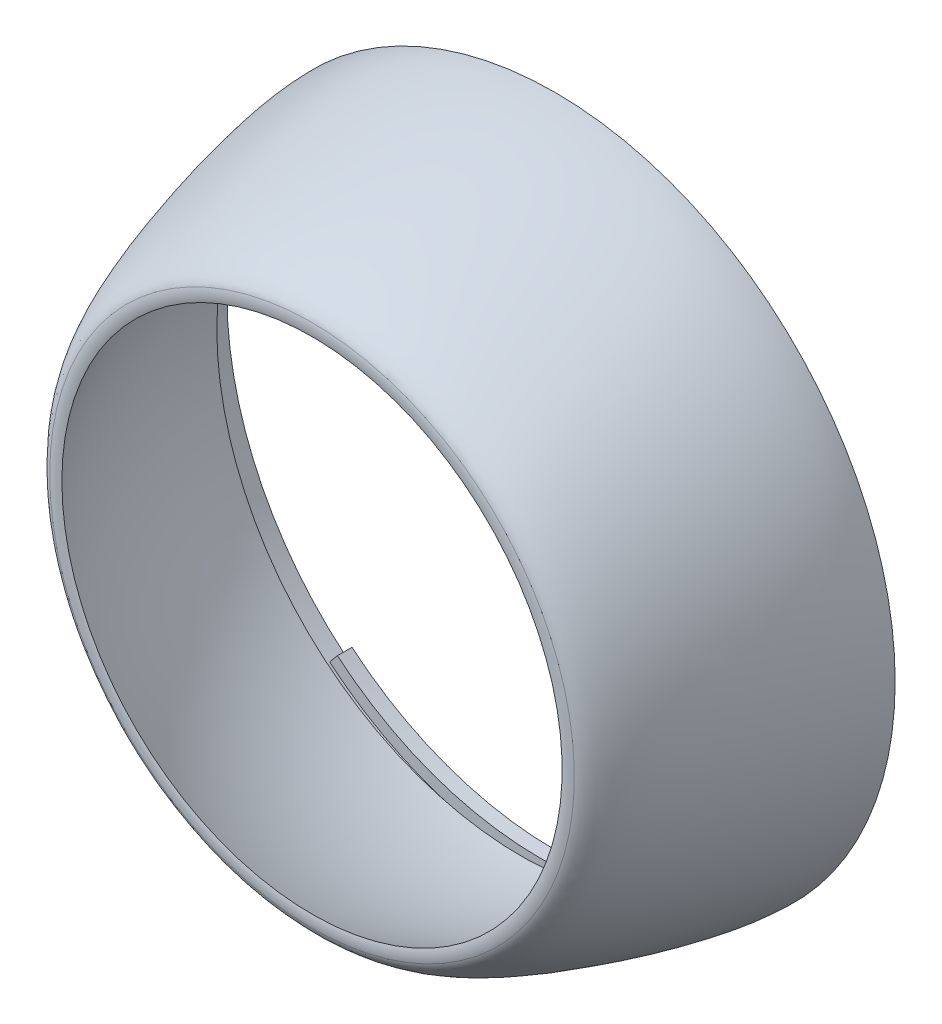
ISO-10303-21;
HEADER;
FILE_DESCRIPTION(('STEP AP214'),'2;1');
FILE_NAME('part.step','',(''),(''),'','','');
FILE_SCHEMA(('AUTOMOTIVE_DESIGN { 1 0 10303 214 1 1 1 1 }'));
ENDSEC;
DATA;
#1=APPLICATION_CONTEXT('core data for automotive mechanical design processes');
#2=APPLICATION_PROTOCOL_DEFINITION('international standard','automotive_design',2000,#1);
#3=PRODUCT_CONTEXT('',#1,'mechanical');
#4=PRODUCT('Part','Part','',(#3));
#5=PRODUCT_RELATED_PRODUCT_CATEGORY('part','',(#4));
#6=PRODUCT_DEFINITION_FORMATION('','',#4);
#7=PRODUCT_DEFINITION_CONTEXT('part definition',#1,'design');
#8=PRODUCT_DEFINITION('design','',#6,#7);
#9=PRODUCT_DEFINITION_SHAPE('','',#8);
#10=(LENGTH_UNIT() NAMED_UNIT(*) SI_UNIT(.MILLI.,.METRE.));
#11=(NAMED_UNIT(*) PLANE_ANGLE_UNIT() SI_UNIT($,.RADIAN.));
#12=(NAMED_UNIT(*) SI_UNIT($,.STERADIAN.) SOLID_ANGLE_UNIT());
#13=UNCERTAINTY_MEASURE_WITH_UNIT(LENGTH_MEASURE(1.E-05),#10,'distance_accuracy_value','');
#14=(GEOMETRIC_REPRESENTATION_CONTEXT(3) GLOBAL_UNCERTAINTY_ASSIGNED_CONTEXT((#13)) GLOBAL_UNIT_ASSIGNED_CONTEXT((#10,
#11,#12)) REPRESENTATION_CONTEXT('',''));
#15=CARTESIAN_POINT('',(0.,0.,0.));
#16=DIRECTION('',(0.,0.,1.));
#17=DIRECTION('',(1.,0.,0.));
#18=AXIS2_PLACEMENT_3D('',#15,#16,#17);
#19=CARTESIAN_POINT('',(0.,20.5897107952854,20.));
#20=CARTESIAN_POINT('',(0.,25.4987449525054,10.5850621443929));
#21=CARTESIAN_POINT('',(0.,25.,0.));
#22=B_SPLINE_CURVE_WITH_KNOTS('',2,(#19,#20,#21),.UNSPECIFIED.,.F.,.F.,(3,3),(0.,1.),.UNSPECIFIED.);
#23=CARTESIAN_POINT('',(0.,0.,0.));
#24=DIRECTION('',(0.,0.,-1.));
#25=AXIS1_PLACEMENT('',#23,#24);
#26=SURFACE_OF_REVOLUTION('',#22,#25);
#27=CARTESIAN_POINT('',(0.,0.,20.));
#28=DIRECTION('',(0.,0.,-1.));
#29=DIRECTION('',(-1.,0.,0.));
#30=AXIS2_PLACEMENT_3D('',#27,#28,#29);
#31=CIRCLE('',#30,20.5897107952854);
#32=CARTESIAN_POINT('',(-20.5897107952854,0.,20.));
#33=VERTEX_POINT('',#32);
#34=EDGE_CURVE('E199',#33,#33,#31,.T.);
#35=ORIENTED_EDGE('',*,*,#34,.F.);
#36=EDGE_LOOP('',(#35));
#37=FACE_BOUND('',#36,.T.);
#38=CARTESIAN_POINT('',(0.,0.,2.8));
#39=DIRECTION('',(0.,0.,-1.));
#40=DIRECTION('',(-1.,0.,0.));
#41=AXIS2_PLACEMENT_3D('',#38,#39,#40);
#42=CIRCLE('',#41,25.0369004081531);
#43=CARTESIAN_POINT('',(-25.0369004081531,0.,2.8));
#44=VERTEX_POINT('',#43);
#45=EDGE_CURVE('E78',#44,#44,#42,.T.);
#46=ORIENTED_EDGE('',*,*,#45,.T.);
#47=EDGE_LOOP('',(#46));
#48=FACE_BOUND('',#47,.T.);
#49=ADVANCED_FACE('F74',(#37,#48),#26,.F.);
#50=CARTESIAN_POINT('',(0.,28.,0.));
#51=DIRECTION('',(0.,0.,-1.));
#52=DIRECTION('',(-1.,0.,0.));
#53=AXIS2_PLACEMENT_3D('',#50,#51,#52);
#54=PLANE('',#53);
#55=CARTESIAN_POINT('',(0.,0.,0.));
#56=DIRECTION('',(0.,0.,-1.));
#57=DIRECTION('',(-1.,0.,0.));
#58=AXIS2_PLACEMENT_3D('',#55,#56,#57);
#59=CIRCLE('',#58,26.);
#60=CARTESIAN_POINT('',(13.,22.5166604983954,0.));
#61=VERTEX_POINT('',#60);
#62=CARTESIAN_POINT('',(24.4320081404336,-8.89252372646752,0.));
#63=VERTEX_POINT('',#62);
#64=EDGE_CURVE('E163',#61,#63,#59,.T.);
#65=ORIENTED_EDGE('',*,*,#64,.F.);
#66=DIRECTION('',(0.500000000000001,0.866025403784438,0.));
#67=VECTOR('',#66,1.);
#68=CARTESIAN_POINT('',(12.1243556529822,21.,0.));
#69=LINE('',#68,#67);
#70=CARTESIAN_POINT('',(13.5,23.3826859021798,0.));
#71=VERTEX_POINT('',#70);
#72=EDGE_CURVE('E192',#61,#71,#69,.T.);
#73=ORIENTED_EDGE('',*,*,#72,.T.);
#74=CARTESIAN_POINT('',(0.,0.,0.));
#75=DIRECTION('',(0.,0.,-1.));
#76=DIRECTION('',(-1.,0.,0.));
#77=AXIS2_PLACEMENT_3D('',#74,#75,#76);
#78=CIRCLE('',#77,27.);
#79=CARTESIAN_POINT('',(0.,27.,0.));
#80=VERTEX_POINT('',#79);
#81=EDGE_CURVE('E306',#80,#71,#78,.T.);
#82=ORIENTED_EDGE('',*,*,#81,.F.);
#83=DIRECTION('',(0.,-1.,0.));
#84=VECTOR('',#83,1.);
#85=CARTESIAN_POINT('',(0.,0.,0.));
#86=LINE('',#85,#84);
#87=CARTESIAN_POINT('',(0.,26.,0.));
#88=VERTEX_POINT('',#87);
#89=EDGE_CURVE('E298',#80,#88,#86,.T.);
#90=ORIENTED_EDGE('',*,*,#89,.T.);
#91=CARTESIAN_POINT('',(0.,0.,0.));
#92=DIRECTION('',(0.,0.,-1.));
#93=DIRECTION('',(-1.,0.,0.));
#94=AXIS2_PLACEMENT_3D('',#91,#92,#93);
#95=CIRCLE('',#94,26.);
#96=CARTESIAN_POINT('',(-24.4320081404335,8.89252372646769,0.));
#97=VERTEX_POINT('',#96);
#98=EDGE_CURVE('E349',#97,#88,#95,.T.);
#99=ORIENTED_EDGE('',*,*,#98,.F.);
#100=DIRECTION('',(-0.939692620785904,0.34202014332568,0.));
#101=VECTOR('',#100,1.);
#102=CARTESIAN_POINT('',(-8.99902653561181,3.27537779633453,0.));
#103=LINE('',#102,#101);
#104=CARTESIAN_POINT('',(-25.3717007612194,9.23454386979337,0.));
#105=VERTEX_POINT('',#104);
#106=EDGE_CURVE('E12',#97,#105,#103,.T.);
#107=ORIENTED_EDGE('',*,*,#106,.T.);
#108=CARTESIAN_POINT('',(0.,0.,0.));
#109=DIRECTION('',(0.,0.,-1.));
#110=DIRECTION('',(-1.,0.,0.));
#111=AXIS2_PLACEMENT_3D('',#108,#109,#110);
#112=CIRCLE('',#111,27.);
#113=CARTESIAN_POINT('',(-17.3552654615367,-20.6831999642123,0.));
#114=VERTEX_POINT('',#113);
#115=EDGE_CURVE('E253',#114,#105,#112,.T.);
#116=ORIENTED_EDGE('',*,*,#115,.F.);
#117=DIRECTION('',(0.642787609686546,0.766044443118973,0.));
#118=VECTOR('',#117,1.);
#119=CARTESIAN_POINT('',(0.,0.,0.));
#120=LINE('',#119,#118);
#121=CARTESIAN_POINT('',(-16.7124778518502,-19.9171555210933,0.));
#122=VERTEX_POINT('',#121);
#123=EDGE_CURVE('E248',#114,#122,#120,.T.);
#124=ORIENTED_EDGE('',*,*,#123,.T.);
#125=CARTESIAN_POINT('',(0.,0.,0.));
#126=DIRECTION('',(0.,0.,-1.));
#127=DIRECTION('',(-1.,0.,0.));
#128=AXIS2_PLACEMENT_3D('',#125,#126,#127);
#129=CIRCLE('',#128,26.);
#130=CARTESIAN_POINT('',(8.89252372646724,-24.4320081404337,0.));
#131=VERTEX_POINT('',#130);
#132=EDGE_CURVE('E268',#131,#122,#129,.T.);
#133=ORIENTED_EDGE('',*,*,#132,.F.);
#134=DIRECTION('',(0.342020143325663,-0.93969262078591,0.));
#135=VECTOR('',#134,1.);
#136=CARTESIAN_POINT('',(-8.99902653561142,24.7246222036658,0.));
#137=LINE('',#136,#135);
#138=CARTESIAN_POINT('',(9.2345438697929,-25.3717007612196,0.));
#139=VERTEX_POINT('',#138);
#140=EDGE_CURVE('E84',#131,#139,#137,.T.);
#141=ORIENTED_EDGE('',*,*,#140,.T.);
#142=CARTESIAN_POINT('',(0.,0.,0.));
#143=DIRECTION('',(0.,0.,-1.));
#144=DIRECTION('',(-1.,0.,0.));
#145=AXIS2_PLACEMENT_3D('',#142,#143,#144);
#146=CIRCLE('',#145,27.);
#147=CARTESIAN_POINT('',(25.3717007612195,-9.23454386979318,0.));
#148=VERTEX_POINT('',#147);
#149=EDGE_CURVE('E190',#148,#139,#146,.T.);
#150=ORIENTED_EDGE('',*,*,#149,.F.);
#151=DIRECTION('',(0.939692620785907,-0.342020143325673,0.));
#152=VECTOR('',#151,1.);
#153=CARTESIAN_POINT('',(-8.99902653561166,3.27537779633439,0.));
#154=LINE('',#153,#152);
#155=EDGE_CURVE('E180',#63,#148,#154,.T.);
#156=ORIENTED_EDGE('',*,*,#155,.F.);
#157=EDGE_LOOP('',(#65,#73,#82,#90,#99,#107,#116,#124,#133,#141,#150,#156));
#158=FACE_BOUND('',#157,.T.);
#159=CARTESIAN_POINT('',(0.,0.,0.));
#160=DIRECTION('',(0.,0.,-1.));
#161=DIRECTION('',(-1.,0.,0.));
#162=AXIS2_PLACEMENT_3D('',#159,#160,#161);
#163=CIRCLE('',#162,28.);
#164=CARTESIAN_POINT('',(-28.,0.,0.));
#165=VERTEX_POINT('',#164);
#166=EDGE_CURVE('E209',#165,#165,#163,.T.);
#167=ORIENTED_EDGE('',*,*,#166,.T.);
#168=EDGE_LOOP('',(#167));
#169=FACE_BOUND('',#168,.T.);
#170=ADVANCED_FACE('F187',(#158,#169),#54,.T.);
#171=CARTESIAN_POINT('',(0.,0.,18.2094442391216));
#172=DIRECTION('',(0.,0.,-1.));
#173=DIRECTION('',(-1.,0.,0.));
#174=AXIS2_PLACEMENT_3D('',#171,#172,#173);
#175=TOROIDAL_SURFACE('',#174,21.0897107952854,1.85905619409817);
#176=ORIENTED_EDGE('',*,*,#34,.T.);
#177=EDGE_LOOP('',(#176));
#178=FACE_BOUND('',#177,.T.);
#179=CARTESIAN_POINT('',(0.,0.,20.));
#180=DIRECTION('',(0.,0.,-1.));
#181=DIRECTION('',(-1.,0.,0.));
#182=AXIS2_PLACEMENT_3D('',#179,#180,#181);
#183=CIRCLE('',#182,21.5897107952854);
#184=CARTESIAN_POINT('',(-21.5897107952854,0.,20.));
#185=VERTEX_POINT('',#184);
#186=EDGE_CURVE('E205',#185,#185,#183,.T.);
#187=ORIENTED_EDGE('',*,*,#186,.F.);
#188=EDGE_LOOP('',(#187));
#189=FACE_BOUND('',#188,.T.);
#190=ADVANCED_FACE('F229',(#178,#189),#175,.T.);
#191=CARTESIAN_POINT('',(0.,28.,0.));
#192=CARTESIAN_POINT('',(0.,28.0300031617752,2.20399987529257));
#193=CARTESIAN_POINT('',(0.,26.5394207378202,10.1007739102042));
#194=CARTESIAN_POINT('',(0.,23.1896143082919,19.5532382883676));
#195=CARTESIAN_POINT('',(0.,21.5897107952854,20.));
#196=B_SPLINE_CURVE_WITH_KNOTS('',3,(#191,#192,#193,#194,#195),.UNSPECIFIED.,.F.,.F.,(4,1,4),
(0.,0.471702376095379,1.),.UNSPECIFIED.);
#197=CARTESIAN_POINT('',(0.,0.,0.));
#198=DIRECTION('',(0.,0.,-1.));
#199=AXIS1_PLACEMENT('',#197,#198);
#200=SURFACE_OF_REVOLUTION('',#196,#199);
#201=ORIENTED_EDGE('',*,*,#186,.T.);
#202=EDGE_LOOP('',(#201));
#203=FACE_BOUND('',#202,.T.);
#204=ORIENTED_EDGE('',*,*,#166,.F.);
#205=EDGE_LOOP('',(#204));
#206=FACE_BOUND('',#205,.T.);
#207=ADVANCED_FACE('F225',(#203,#206),#200,.F.);
#208=CARTESIAN_POINT('',(0.,0.,1.2));
#209=DIRECTION('',(1.,0.,0.));
#210=DIRECTION('',(0.,1.,0.));
#211=AXIS2_PLACEMENT_3D('',#208,#209,#210);
#212=PLANE('',#211);
#213=DIRECTION('',(0.,0.,-1.));
#214=VECTOR('',#213,1.);
#215=CARTESIAN_POINT('',(0.,26.,20.0695004332198));
#216=LINE('',#215,#214);
#217=CARTESIAN_POINT('',(0.,26.,1.2));
#218=VERTEX_POINT('',#217);
#219=EDGE_CURVE('E99',#218,#88,#216,.T.);
#220=ORIENTED_EDGE('',*,*,#219,.T.);
#221=ORIENTED_EDGE('',*,*,#89,.F.);
#222=DIRECTION('',(0.,0.,-1.));
#223=VECTOR('',#222,1.);
#224=CARTESIAN_POINT('',(0.,27.,1.2));
#225=LINE('',#224,#223);
#226=CARTESIAN_POINT('',(0.,27.,1.2));
#227=VERTEX_POINT('',#226);
#228=EDGE_CURVE('E309',#227,#80,#225,.T.);
#229=ORIENTED_EDGE('',*,*,#228,.F.);
#230=DIRECTION('',(0.,-1.,0.));
#231=VECTOR('',#230,1.);
#232=CARTESIAN_POINT('',(0.,0.,1.2));
#233=LINE('',#232,#231);
#234=EDGE_CURVE('E301',#227,#218,#233,.T.);
#235=ORIENTED_EDGE('',*,*,#234,.T.);
#236=EDGE_LOOP('',(#220,#221,#229,#235));
#237=FACE_BOUND('',#236,.T.);
#238=ADVANCED_FACE('F228',(#237),#212,.T.);
#239=CARTESIAN_POINT('',(0.,0.,1.2));
#240=DIRECTION('',(-0.866025403784438,0.500000000000001,0.));
#241=DIRECTION('',(-0.500000000000001,-0.866025403784438,0.));
#242=AXIS2_PLACEMENT_3D('',#239,#240,#241);
#243=PLANE('',#242);
#244=DIRECTION('',(0.,0.,-1.));
#245=VECTOR('',#244,1.);
#246=CARTESIAN_POINT('',(13.,22.5166604983954,20.0695004332198));
#247=LINE('',#246,#245);
#248=CARTESIAN_POINT('',(13.,22.5166604983954,1.2));
#249=VERTEX_POINT('',#248);
#250=EDGE_CURVE('E169',#61,#249,#247,.F.);
#251=ORIENTED_EDGE('',*,*,#250,.T.);
#252=DIRECTION('',(0.500000000000001,0.866025403784438,0.));
#253=VECTOR('',#252,1.);
#254=CARTESIAN_POINT('',(0.,0.,1.2));
#255=LINE('',#254,#253);
#256=CARTESIAN_POINT('',(13.5,23.3826859021798,1.2));
#257=VERTEX_POINT('',#256);
#258=EDGE_CURVE('E305',#249,#257,#255,.T.);
#259=ORIENTED_EDGE('',*,*,#258,.T.);
#260=DIRECTION('',(0.,0.,-1.));
#261=VECTOR('',#260,1.);
#262=CARTESIAN_POINT('',(13.5,23.3826859021798,1.2));
#263=LINE('',#262,#261);
#264=EDGE_CURVE('E213',#257,#71,#263,.T.);
#265=ORIENTED_EDGE('',*,*,#264,.T.);
#266=ORIENTED_EDGE('',*,*,#72,.F.);
#267=EDGE_LOOP('',(#251,#259,#265,#266));
#268=FACE_BOUND('',#267,.T.);
#269=ADVANCED_FACE('F332',(#268),#243,.T.);
#270=CARTESIAN_POINT('',(0.,0.,1.2));
#271=DIRECTION('',(0.,0.,-1.));
#272=DIRECTION('',(-1.,0.,0.));
#273=AXIS2_PLACEMENT_3D('',#270,#271,#272);
#274=CYLINDRICAL_SURFACE('',#273,27.);
#275=ORIENTED_EDGE('',*,*,#81,.T.);
#276=ORIENTED_EDGE('',*,*,#264,.F.);
#277=CARTESIAN_POINT('',(0.,0.,1.2));
#278=DIRECTION('',(0.,0.,-1.));
#279=DIRECTION('',(-1.,0.,0.));
#280=AXIS2_PLACEMENT_3D('',#277,#278,#279);
#281=CIRCLE('',#280,27.);
#282=CARTESIAN_POINT('',(25.3717007612195,-9.23454386979318,1.2));
#283=VERTEX_POINT('',#282);
#284=EDGE_CURVE('E264',#257,#283,#281,.T.);
#285=ORIENTED_EDGE('',*,*,#284,.T.);
#286=DIRECTION('',(0.,0.,-1.));
#287=VECTOR('',#286,1.);
#288=CARTESIAN_POINT('',(25.3717007612195,-9.23454386979318,1.2));
#289=LINE('',#288,#287);
#290=EDGE_CURVE('E291',#283,#148,#289,.T.);
#291=ORIENTED_EDGE('',*,*,#290,.T.);
#292=ORIENTED_EDGE('',*,*,#149,.T.);
#293=DIRECTION('',(0.,0.,-1.));
#294=VECTOR('',#293,1.);
#295=CARTESIAN_POINT('',(9.2345438697929,-25.3717007612196,1.2));
#296=LINE('',#295,#294);
#297=CARTESIAN_POINT('',(9.2345438697929,-25.3717007612196,1.2));
#298=VERTEX_POINT('',#297);
#299=EDGE_CURVE('E294',#298,#139,#296,.T.);
#300=ORIENTED_EDGE('',*,*,#299,.F.);
#301=CARTESIAN_POINT('',(-17.3552654615367,-20.6831999642123,1.2));
#302=VERTEX_POINT('',#301);
#303=EDGE_CURVE('E266',#298,#302,#281,.T.);
#304=ORIENTED_EDGE('',*,*,#303,.T.);
#305=DIRECTION('',(0.,0.,-1.));
#306=VECTOR('',#305,1.);
#307=CARTESIAN_POINT('',(-17.3552654615367,-20.6831999642123,1.2));
#308=LINE('',#307,#306);
#309=EDGE_CURVE('E276',#302,#114,#308,.T.);
#310=ORIENTED_EDGE('',*,*,#309,.T.);
#311=ORIENTED_EDGE('',*,*,#115,.T.);
#312=DIRECTION('',(0.,0.,-1.));
#313=VECTOR('',#312,1.);
#314=CARTESIAN_POINT('',(-25.3717007612194,9.23454386979337,1.2));
#315=LINE('',#314,#313);
#316=CARTESIAN_POINT('',(-25.3717007612194,9.23454386979336,1.2));
#317=VERTEX_POINT('',#316);
#318=EDGE_CURVE('E281',#317,#105,#315,.T.);
#319=ORIENTED_EDGE('',*,*,#318,.F.);
#320=EDGE_CURVE('E257',#317,#227,#281,.T.);
#321=ORIENTED_EDGE('',*,*,#320,.T.);
#322=ORIENTED_EDGE('',*,*,#228,.T.);
#323=EDGE_LOOP('',(#275,#276,#285,#291,#292,#300,#304,#310,#311,#319,#321,#322));
#324=FACE_BOUND('',#323,.T.);
#325=CARTESIAN_POINT('',(0.,0.,2.8));
#326=DIRECTION('',(0.,0.,-1.));
#327=DIRECTION('',(-1.,0.,0.));
#328=AXIS2_PLACEMENT_3D('',#325,#326,#327);
#329=CIRCLE('',#328,27.);
#330=CARTESIAN_POINT('',(-27.,0.,2.8));
#331=VERTEX_POINT('',#330);
#332=EDGE_CURVE('E249',#331,#331,#329,.T.);
#333=ORIENTED_EDGE('',*,*,#332,.F.);
#334=EDGE_LOOP('',(#333));
#335=FACE_BOUND('',#334,.T.);
#336=ADVANCED_FACE('F324',(#324,#335),#274,.F.);
#337=CARTESIAN_POINT('',(0.,0.,1.2));
#338=DIRECTION('',(0.93969262078591,0.342020143325663,0.));
#339=DIRECTION('',(-0.342020143325663,0.93969262078591,0.));
#340=AXIS2_PLACEMENT_3D('',#337,#338,#339);
#341=PLANE('',#340);
#342=DIRECTION('',(0.,0.,-1.));
#343=VECTOR('',#342,1.);
#344=CARTESIAN_POINT('',(8.89252372646724,-24.4320081404337,20.0695004332198));
#345=LINE('',#344,#343);
#346=CARTESIAN_POINT('',(8.89252372646724,-24.4320081404337,1.2));
#347=VERTEX_POINT('',#346);
#348=EDGE_CURVE('E358',#131,#347,#345,.F.);
#349=ORIENTED_EDGE('',*,*,#348,.T.);
#350=DIRECTION('',(0.342020143325663,-0.939692620785911,0.));
#351=VECTOR('',#350,1.);
#352=CARTESIAN_POINT('',(0.,0.,1.2));
#353=LINE('',#352,#351);
#354=EDGE_CURVE('E287',#347,#298,#353,.T.);
#355=ORIENTED_EDGE('',*,*,#354,.T.);
#356=ORIENTED_EDGE('',*,*,#299,.T.);
#357=ORIENTED_EDGE('',*,*,#140,.F.);
#358=EDGE_LOOP('',(#349,#355,#356,#357));
#359=FACE_BOUND('',#358,.T.);
#360=ADVANCED_FACE('F382',(#359),#341,.T.);
#361=CARTESIAN_POINT('',(0.,0.,1.2));
#362=DIRECTION('',(0.342020143325673,0.939692620785907,0.));
#363=DIRECTION('',(-0.939692620785907,0.342020143325673,0.));
#364=AXIS2_PLACEMENT_3D('',#361,#362,#363);
#365=PLANE('',#364);
#366=DIRECTION('',(0.939692620785907,-0.342020143325673,0.));
#367=VECTOR('',#366,1.);
#368=CARTESIAN_POINT('',(0.,0.,1.2));
#369=LINE('',#368,#367);
#370=CARTESIAN_POINT('',(24.4320081404336,-8.89252372646751,1.2));
#371=VERTEX_POINT('',#370);
#372=EDGE_CURVE('E182',#371,#283,#369,.T.);
#373=ORIENTED_EDGE('',*,*,#372,.F.);
#374=DIRECTION('',(0.,0.,-1.));
#375=VECTOR('',#374,1.);
#376=CARTESIAN_POINT('',(24.4320081404336,-8.89252372646751,20.0695004332198));
#377=LINE('',#376,#375);
#378=EDGE_CURVE('E166',#63,#371,#377,.F.);
#379=ORIENTED_EDGE('',*,*,#378,.F.);
#380=ORIENTED_EDGE('',*,*,#155,.T.);
#381=ORIENTED_EDGE('',*,*,#290,.F.);
#382=EDGE_LOOP('',(#373,#379,#380,#381));
#383=FACE_BOUND('',#382,.T.);
#384=ADVANCED_FACE('F178',(#383),#365,.F.);
#385=CARTESIAN_POINT('',(0.,0.,1.2));
#386=DIRECTION('',(-0.34202014332568,-0.939692620785904,0.));
#387=DIRECTION('',(0.939692620785904,-0.34202014332568,0.));
#388=AXIS2_PLACEMENT_3D('',#385,#386,#387);
#389=PLANE('',#388);
#390=DIRECTION('',(0.,0.,-1.));
#391=VECTOR('',#390,1.);
#392=CARTESIAN_POINT('',(-24.4320081404335,8.89252372646769,20.0695004332198));
#393=LINE('',#392,#391);
#394=CARTESIAN_POINT('',(-24.4320081404335,8.89252372646769,1.2));
#395=VERTEX_POINT('',#394);
#396=EDGE_CURVE('E347',#97,#395,#393,.F.);
#397=ORIENTED_EDGE('',*,*,#396,.T.);
#398=DIRECTION('',(-0.939692620785904,0.34202014332568,0.));
#399=VECTOR('',#398,1.);
#400=CARTESIAN_POINT('',(0.,0.,1.2));
#401=LINE('',#400,#399);
#402=EDGE_CURVE('E271',#395,#317,#401,.T.);
#403=ORIENTED_EDGE('',*,*,#402,.T.);
#404=ORIENTED_EDGE('',*,*,#318,.T.);
#405=ORIENTED_EDGE('',*,*,#106,.F.);
#406=EDGE_LOOP('',(#397,#403,#404,#405));
#407=FACE_BOUND('',#406,.T.);
#408=ADVANCED_FACE('F371',(#407),#389,.T.);
#409=CARTESIAN_POINT('',(0.,0.,1.2));
#410=DIRECTION('',(-0.766044443118972,0.642787609686546,0.));
#411=DIRECTION('',(-0.642787609686546,-0.766044443118973,0.));
#412=AXIS2_PLACEMENT_3D('',#409,#410,#411);
#413=PLANE('',#412);
#414=DIRECTION('',(0.,0.,-1.));
#415=VECTOR('',#414,1.);
#416=CARTESIAN_POINT('',(-16.7124778518502,-19.9171555210933,20.0695004332198));
#417=LINE('',#416,#415);
#418=CARTESIAN_POINT('',(-16.7124778518502,-19.9171555210933,1.2));
#419=VERTEX_POINT('',#418);
#420=EDGE_CURVE('E91',#419,#122,#417,.T.);
#421=ORIENTED_EDGE('',*,*,#420,.T.);
#422=ORIENTED_EDGE('',*,*,#123,.F.);
#423=ORIENTED_EDGE('',*,*,#309,.F.);
#424=DIRECTION('',(0.642787609686546,0.766044443118973,0.));
#425=VECTOR('',#424,1.);
#426=CARTESIAN_POINT('',(0.,0.,1.2));
#427=LINE('',#426,#425);
#428=EDGE_CURVE('E273',#302,#419,#427,.T.);
#429=ORIENTED_EDGE('',*,*,#428,.T.);
#430=EDGE_LOOP('',(#421,#422,#423,#429));
#431=FACE_BOUND('',#430,.T.);
#432=ADVANCED_FACE('F364',(#431),#413,.T.);
#433=CARTESIAN_POINT('',(0.,0.,1.2));
#434=DIRECTION('',(0.,0.,-1.));
#435=DIRECTION('',(-1.,0.,0.));
#436=AXIS2_PLACEMENT_3D('',#433,#434,#435);
#437=PLANE('',#436);
#438=ORIENTED_EDGE('',*,*,#354,.F.);
#439=CARTESIAN_POINT('',(0.,0.,1.2));
#440=DIRECTION('',(0.,0.,-1.));
#441=DIRECTION('',(-1.,0.,0.));
#442=AXIS2_PLACEMENT_3D('',#439,#440,#441);
#443=CIRCLE('',#442,26.);
#444=EDGE_CURVE('E355',#419,#347,#443,.F.);
#445=ORIENTED_EDGE('',*,*,#444,.F.);
#446=ORIENTED_EDGE('',*,*,#428,.F.);
#447=ORIENTED_EDGE('',*,*,#303,.F.);
#448=EDGE_LOOP('',(#438,#445,#446,#447));
#449=FACE_BOUND('',#448,.T.);
#450=ADVANCED_FACE('F393',(#449),#437,.F.);
#451=ORIENTED_EDGE('',*,*,#402,.F.);
#452=CARTESIAN_POINT('',(0.,0.,1.2));
#453=DIRECTION('',(0.,0.,-1.));
#454=DIRECTION('',(-1.,0.,0.));
#455=AXIS2_PLACEMENT_3D('',#452,#453,#454);
#456=CIRCLE('',#455,26.);
#457=EDGE_CURVE('E184',#218,#395,#456,.F.);
#458=ORIENTED_EDGE('',*,*,#457,.F.);
#459=ORIENTED_EDGE('',*,*,#234,.F.);
#460=ORIENTED_EDGE('',*,*,#320,.F.);
#461=EDGE_LOOP('',(#451,#458,#459,#460));
#462=FACE_BOUND('',#461,.T.);
#463=ADVANCED_FACE('F374',(#462),#437,.F.);
#464=CARTESIAN_POINT('',(0.,0.,2.8));
#465=DIRECTION('',(0.,0.,-1.));
#466=DIRECTION('',(-1.,0.,0.));
#467=AXIS2_PLACEMENT_3D('',#464,#465,#466);
#468=PLANE('',#467);
#469=ORIENTED_EDGE('',*,*,#45,.F.);
#470=EDGE_LOOP('',(#469));
#471=FACE_BOUND('',#470,.T.);
#472=ORIENTED_EDGE('',*,*,#332,.T.);
#473=EDGE_LOOP('',(#472));
#474=FACE_BOUND('',#473,.T.);
#475=ADVANCED_FACE('F397',(#471,#474),#468,.T.);
#476=ORIENTED_EDGE('',*,*,#258,.F.);
#477=CARTESIAN_POINT('',(0.,0.,1.2));
#478=DIRECTION('',(0.,0.,-1.));
#479=DIRECTION('',(-1.,0.,0.));
#480=AXIS2_PLACEMENT_3D('',#477,#478,#479);
#481=CIRCLE('',#480,26.);
#482=EDGE_CURVE('E174',#371,#249,#481,.F.);
#483=ORIENTED_EDGE('',*,*,#482,.F.);
#484=ORIENTED_EDGE('',*,*,#372,.T.);
#485=ORIENTED_EDGE('',*,*,#284,.F.);
#486=EDGE_LOOP('',(#476,#483,#484,#485));
#487=FACE_BOUND('',#486,.T.);
#488=ADVANCED_FACE('F394',(#487),#437,.F.);
#489=CARTESIAN_POINT('',(0.,0.,20.0695004332198));
#490=DIRECTION('',(0.,0.,-1.));
#491=DIRECTION('',(-1.,0.,0.));
#492=AXIS2_PLACEMENT_3D('',#489,#490,#491);
#493=CYLINDRICAL_SURFACE('',#492,26.);
#494=ORIENTED_EDGE('',*,*,#64,.T.);
#495=ORIENTED_EDGE('',*,*,#378,.T.);
#496=ORIENTED_EDGE('',*,*,#482,.T.);
#497=ORIENTED_EDGE('',*,*,#250,.F.);
#498=EDGE_LOOP('',(#494,#495,#496,#497));
#499=FACE_BOUND('',#498,.T.);
#500=ADVANCED_FACE('F165',(#499),#493,.F.);
#501=CARTESIAN_POINT('',(0.,0.,20.0695004332198));
#502=DIRECTION('',(0.,0.,-1.));
#503=DIRECTION('',(-1.,0.,0.));
#504=AXIS2_PLACEMENT_3D('',#501,#502,#503);
#505=CYLINDRICAL_SURFACE('',#504,26.);
#506=ORIENTED_EDGE('',*,*,#457,.T.);
#507=ORIENTED_EDGE('',*,*,#396,.F.);
#508=ORIENTED_EDGE('',*,*,#98,.T.);
#509=ORIENTED_EDGE('',*,*,#219,.F.);
#510=EDGE_LOOP('',(#506,#507,#508,#509));
#511=FACE_BOUND('',#510,.T.);
#512=ADVANCED_FACE('F403',(#511),#505,.F.);
#513=CARTESIAN_POINT('',(0.,0.,20.0695004332198));
#514=DIRECTION('',(0.,0.,-1.));
#515=DIRECTION('',(-1.,0.,0.));
#516=AXIS2_PLACEMENT_3D('',#513,#514,#515);
#517=CYLINDRICAL_SURFACE('',#516,26.);
#518=ORIENTED_EDGE('',*,*,#132,.T.);
#519=ORIENTED_EDGE('',*,*,#420,.F.);
#520=ORIENTED_EDGE('',*,*,#444,.T.);
#521=ORIENTED_EDGE('',*,*,#348,.F.);
#522=EDGE_LOOP('',(#518,#519,#520,#521));
#523=FACE_BOUND('',#522,.T.);
#524=ADVANCED_FACE('F400',(#523),#517,.F.);
#525=CLOSED_SHELL('',(#49,#170,#190,#207,#238,#269,#336,#360,#384,#408,#432,#450,#463,#475,#488,
#500,#512,#524));
#526=MANIFOLD_SOLID_BREP('B2',#525);
#527=ADVANCED_BREP_SHAPE_REPRESENTATION('',(#18,#526),#14);
#528=SHAPE_DEFINITION_REPRESENTATION(#9,#527);
ENDSEC;
END-ISO-10303-21;
